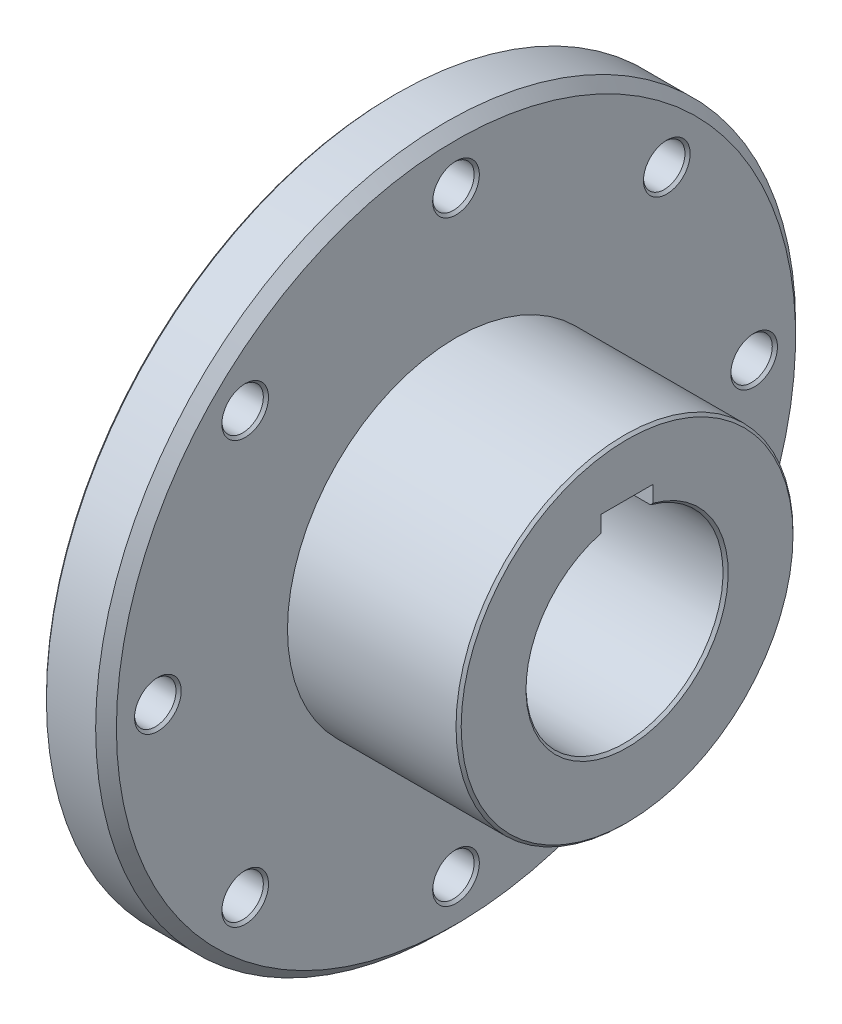
ISO-10303-21;
HEADER;
FILE_DESCRIPTION(('STEP AP214'),'2;1');
FILE_NAME('part.step','',(''),(''),'','','');
FILE_SCHEMA(('AUTOMOTIVE_DESIGN { 1 0 10303 214 1 1 1 1 }'));
ENDSEC;
DATA;
#1=APPLICATION_CONTEXT('core data for automotive mechanical design processes');
#2=APPLICATION_PROTOCOL_DEFINITION('international standard','automotive_design',2000,#1);
#3=PRODUCT_CONTEXT('',#1,'mechanical');
#4=PRODUCT('Part','Part','',(#3));
#5=PRODUCT_RELATED_PRODUCT_CATEGORY('part','',(#4));
#6=PRODUCT_DEFINITION_FORMATION('','',#4);
#7=PRODUCT_DEFINITION_CONTEXT('part definition',#1,'design');
#8=PRODUCT_DEFINITION('design','',#6,#7);
#9=PRODUCT_DEFINITION_SHAPE('','',#8);
#10=(LENGTH_UNIT() NAMED_UNIT(*) SI_UNIT(.MILLI.,.METRE.));
#11=(NAMED_UNIT(*) PLANE_ANGLE_UNIT() SI_UNIT($,.RADIAN.));
#12=(NAMED_UNIT(*) SI_UNIT($,.STERADIAN.) SOLID_ANGLE_UNIT());
#13=UNCERTAINTY_MEASURE_WITH_UNIT(LENGTH_MEASURE(1.E-05),#10,'distance_accuracy_value','');
#14=(GEOMETRIC_REPRESENTATION_CONTEXT(3) GLOBAL_UNCERTAINTY_ASSIGNED_CONTEXT((#13)) GLOBAL_UNIT_ASSIGNED_CONTEXT((#10,
#11,#12)) REPRESENTATION_CONTEXT('',''));
#15=CARTESIAN_POINT('',(0.,0.,0.));
#16=DIRECTION('',(0.,0.,1.));
#17=DIRECTION('',(1.,0.,0.));
#18=AXIS2_PLACEMENT_3D('',#15,#16,#17);
#19=CARTESIAN_POINT('',(0.,0.,0.));
#20=DIRECTION('',(-1.,0.,0.));
#21=DIRECTION('',(0.,0.,1.));
#22=AXIS2_PLACEMENT_3D('',#19,#20,#21);
#23=CYLINDRICAL_SURFACE('',#22,19.);
#24=DIRECTION('',(-1.,0.,0.));
#25=VECTOR('',#24,1.);
#26=CARTESIAN_POINT('',(0.,18.3303027798234,5.));
#27=LINE('',#26,#25);
#28=CARTESIAN_POINT('',(0.999999999999977,18.3303027798234,5.));
#29=VERTEX_POINT('',#28);
#30=CARTESIAN_POINT('',(54.5,18.3303027798234,5.));
#31=VERTEX_POINT('',#30);
#32=EDGE_CURVE('E125',#29,#31,#27,.F.);
#33=ORIENTED_EDGE('',*,*,#32,.T.);
#34=CARTESIAN_POINT('',(54.5,0.,0.));
#35=DIRECTION('',(-1.,0.,0.));
#36=DIRECTION('',(0.,0.,1.));
#37=AXIS2_PLACEMENT_3D('',#34,#35,#36);
#38=CIRCLE('',#37,19.);
#39=CARTESIAN_POINT('',(54.5,18.3303027798234,-5.));
#40=VERTEX_POINT('',#39);
#41=EDGE_CURVE('E53',#31,#40,#38,.F.);
#42=ORIENTED_EDGE('',*,*,#41,.T.);
#43=DIRECTION('',(-1.,0.,0.));
#44=VECTOR('',#43,1.);
#45=CARTESIAN_POINT('',(0.,18.3303027798234,-5.));
#46=LINE('',#45,#44);
#47=CARTESIAN_POINT('',(0.999999999999977,18.3303027798234,-5.));
#48=VERTEX_POINT('',#47);
#49=EDGE_CURVE('E128',#40,#48,#46,.T.);
#50=ORIENTED_EDGE('',*,*,#49,.T.);
#51=CARTESIAN_POINT('',(0.999999999999977,0.,0.));
#52=DIRECTION('',(1.,0.,0.));
#53=DIRECTION('',(0.,0.,-1.));
#54=AXIS2_PLACEMENT_3D('',#51,#52,#53);
#55=CIRCLE('',#54,19.);
#56=EDGE_CURVE('E146',#48,#29,#55,.F.);
#57=ORIENTED_EDGE('',*,*,#56,.T.);
#58=EDGE_LOOP('',(#33,#42,#50,#57));
#59=FACE_BOUND('',#58,.T.);
#60=ADVANCED_FACE('F37',(#59),#23,.F.);
#61=CARTESIAN_POINT('',(0.,19.,0.));
#62=DIRECTION('',(1.,0.,0.));
#63=DIRECTION('',(0.,0.,-1.));
#64=AXIS2_PLACEMENT_3D('',#61,#62,#63);
#65=PLANE('',#64);
#66=DIRECTION('',(0.,-1.,0.));
#67=VECTOR('',#66,1.);
#68=CARTESIAN_POINT('',(0.,22.,5.));
#69=LINE('',#68,#67);
#70=CARTESIAN_POINT('',(0.,22.,5.));
#71=VERTEX_POINT('',#70);
#72=CARTESIAN_POINT('',(0.,19.3649167310371,5.));
#73=VERTEX_POINT('',#72);
#74=EDGE_CURVE('E115',#71,#73,#69,.T.);
#75=ORIENTED_EDGE('',*,*,#74,.T.);
#76=CARTESIAN_POINT('',(0.,0.,0.));
#77=DIRECTION('',(1.,0.,0.));
#78=DIRECTION('',(0.,0.,-1.));
#79=AXIS2_PLACEMENT_3D('',#76,#77,#78);
#80=CIRCLE('',#79,20.);
#81=CARTESIAN_POINT('',(0.,19.3649167310371,-5.));
#82=VERTEX_POINT('',#81);
#83=EDGE_CURVE('E100',#73,#82,#80,.T.);
#84=ORIENTED_EDGE('',*,*,#83,.T.);
#85=DIRECTION('',(0.,1.,0.));
#86=VECTOR('',#85,1.);
#87=CARTESIAN_POINT('',(0.,22.,-5.));
#88=LINE('',#87,#86);
#89=CARTESIAN_POINT('',(0.,22.,-5.));
#90=VERTEX_POINT('',#89);
#91=EDGE_CURVE('E92',#82,#90,#88,.T.);
#92=ORIENTED_EDGE('',*,*,#91,.T.);
#93=DIRECTION('',(0.,0.,1.));
#94=VECTOR('',#93,1.);
#95=CARTESIAN_POINT('',(0.,22.,5.));
#96=LINE('',#95,#94);
#97=EDGE_CURVE('E98',#90,#71,#96,.T.);
#98=ORIENTED_EDGE('',*,*,#97,.T.);
#99=EDGE_LOOP('',(#75,#84,#92,#98));
#100=FACE_BOUND('',#99,.T.);
#101=CARTESIAN_POINT('',(0.,0.,0.));
#102=DIRECTION('',(-1.,0.,0.));
#103=DIRECTION('',(0.,0.,1.));
#104=AXIS2_PLACEMENT_3D('',#101,#102,#103);
#105=CIRCLE('',#104,32.5);
#106=CARTESIAN_POINT('',(0.,0.,32.5));
#107=VERTEX_POINT('',#106);
#108=EDGE_CURVE('E136',#107,#107,#105,.T.);
#109=ORIENTED_EDGE('',*,*,#108,.T.);
#110=EDGE_LOOP('',(#109));
#111=FACE_BOUND('',#110,.T.);
#112=ADVANCED_FACE('F95',(#100,#111),#65,.F.);
#113=CARTESIAN_POINT('',(0.,0.,0.));
#114=DIRECTION('',(-1.,0.,0.));
#115=DIRECTION('',(0.,0.,1.));
#116=AXIS2_PLACEMENT_3D('',#113,#114,#115);
#117=CYLINDRICAL_SURFACE('',#116,32.5);
#118=ORIENTED_EDGE('',*,*,#108,.F.);
#119=EDGE_LOOP('',(#118));
#120=FACE_BOUND('',#119,.T.);
#121=CARTESIAN_POINT('',(10.,0.,0.));
#122=DIRECTION('',(-1.,0.,0.));
#123=DIRECTION('',(0.,0.,1.));
#124=AXIS2_PLACEMENT_3D('',#121,#122,#123);
#125=CIRCLE('',#124,32.5);
#126=CARTESIAN_POINT('',(10.,0.,32.5));
#127=VERTEX_POINT('',#126);
#128=EDGE_CURVE('E133',#127,#127,#125,.T.);
#129=ORIENTED_EDGE('',*,*,#128,.T.);
#130=EDGE_LOOP('',(#129));
#131=FACE_BOUND('',#130,.T.);
#132=ADVANCED_FACE('F328',(#120,#131),#117,.T.);
#133=CARTESIAN_POINT('',(10.,32.5,0.));
#134=DIRECTION('',(1.,0.,0.));
#135=DIRECTION('',(0.,0.,-1.));
#136=AXIS2_PLACEMENT_3D('',#133,#134,#135);
#137=PLANE('',#136);
#138=CARTESIAN_POINT('',(10.,40.6586399182265,40.6586399182265));
#139=DIRECTION('',(1.,0.,0.));
#140=DIRECTION('',(0.,0.,-1.));
#141=AXIS2_PLACEMENT_3D('',#138,#139,#140);
#142=CIRCLE('',#141,4.49999999999998);
#143=CARTESIAN_POINT('',(10.,40.6586399182265,36.1586399182265));
#144=VERTEX_POINT('',#143);
#145=EDGE_CURVE('E238',#144,#144,#142,.T.);
#146=ORIENTED_EDGE('',*,*,#145,.T.);
#147=EDGE_LOOP('',(#146));
#148=FACE_BOUND('',#147,.T.);
#149=CARTESIAN_POINT('',(10.,0.,57.5));
#150=DIRECTION('',(1.,0.,0.));
#151=DIRECTION('',(0.,0.,-1.));
#152=AXIS2_PLACEMENT_3D('',#149,#150,#151);
#153=CIRCLE('',#152,4.49999999999998);
#154=CARTESIAN_POINT('',(10.,0.,53.));
#155=VERTEX_POINT('',#154);
#156=EDGE_CURVE('E235',#155,#155,#153,.T.);
#157=ORIENTED_EDGE('',*,*,#156,.T.);
#158=EDGE_LOOP('',(#157));
#159=FACE_BOUND('',#158,.T.);
#160=CARTESIAN_POINT('',(10.,-40.6586399182265,40.6586399182265));
#161=DIRECTION('',(1.,0.,0.));
#162=DIRECTION('',(0.,0.,-1.));
#163=AXIS2_PLACEMENT_3D('',#160,#161,#162);
#164=CIRCLE('',#163,4.49999999999998);
#165=CARTESIAN_POINT('',(10.,-40.6586399182265,36.1586399182265));
#166=VERTEX_POINT('',#165);
#167=EDGE_CURVE('E232',#166,#166,#164,.T.);
#168=ORIENTED_EDGE('',*,*,#167,.T.);
#169=EDGE_LOOP('',(#168));
#170=FACE_BOUND('',#169,.T.);
#171=CARTESIAN_POINT('',(10.,-57.5,0.));
#172=DIRECTION('',(1.,0.,0.));
#173=DIRECTION('',(0.,0.,-1.));
#174=AXIS2_PLACEMENT_3D('',#171,#172,#173);
#175=CIRCLE('',#174,4.5);
#176=CARTESIAN_POINT('',(10.,-57.5,-4.50000000000001));
#177=VERTEX_POINT('',#176);
#178=EDGE_CURVE('E229',#177,#177,#175,.T.);
#179=ORIENTED_EDGE('',*,*,#178,.T.);
#180=EDGE_LOOP('',(#179));
#181=FACE_BOUND('',#180,.T.);
#182=CARTESIAN_POINT('',(10.,-40.6586399182265,-40.6586399182265));
#183=DIRECTION('',(1.,0.,0.));
#184=DIRECTION('',(0.,0.,-1.));
#185=AXIS2_PLACEMENT_3D('',#182,#183,#184);
#186=CIRCLE('',#185,4.49999999999998);
#187=CARTESIAN_POINT('',(10.,-40.6586399182265,-45.1586399182265));
#188=VERTEX_POINT('',#187);
#189=EDGE_CURVE('E226',#188,#188,#186,.T.);
#190=ORIENTED_EDGE('',*,*,#189,.T.);
#191=EDGE_LOOP('',(#190));
#192=FACE_BOUND('',#191,.T.);
#193=CARTESIAN_POINT('',(10.,0.,-57.5));
#194=DIRECTION('',(1.,0.,0.));
#195=DIRECTION('',(0.,0.,-1.));
#196=AXIS2_PLACEMENT_3D('',#193,#194,#195);
#197=CIRCLE('',#196,4.49999999999998);
#198=CARTESIAN_POINT('',(10.,0.,-62.));
#199=VERTEX_POINT('',#198);
#200=EDGE_CURVE('E223',#199,#199,#197,.T.);
#201=ORIENTED_EDGE('',*,*,#200,.T.);
#202=EDGE_LOOP('',(#201));
#203=FACE_BOUND('',#202,.T.);
#204=CARTESIAN_POINT('',(10.,40.6586399182265,-40.6586399182265));
#205=DIRECTION('',(1.,0.,0.));
#206=DIRECTION('',(0.,0.,-1.));
#207=AXIS2_PLACEMENT_3D('',#204,#205,#206);
#208=CIRCLE('',#207,4.50000000000006);
#209=CARTESIAN_POINT('',(10.,40.6586399182265,-45.1586399182265));
#210=VERTEX_POINT('',#209);
#211=EDGE_CURVE('E220',#210,#210,#208,.T.);
#212=ORIENTED_EDGE('',*,*,#211,.T.);
#213=EDGE_LOOP('',(#212));
#214=FACE_BOUND('',#213,.T.);
#215=CARTESIAN_POINT('',(10.,57.5,0.));
#216=DIRECTION('',(1.,0.,0.));
#217=DIRECTION('',(0.,0.,-1.));
#218=AXIS2_PLACEMENT_3D('',#215,#216,#217);
#219=CIRCLE('',#218,4.5);
#220=CARTESIAN_POINT('',(10.,57.5,-4.5));
#221=VERTEX_POINT('',#220);
#222=EDGE_CURVE('E217',#221,#221,#219,.T.);
#223=ORIENTED_EDGE('',*,*,#222,.T.);
#224=EDGE_LOOP('',(#223));
#225=FACE_BOUND('',#224,.T.);
#226=CARTESIAN_POINT('',(10.,0.,0.));
#227=DIRECTION('',(1.,0.,0.));
#228=DIRECTION('',(0.,0.,-1.));
#229=AXIS2_PLACEMENT_3D('',#226,#227,#228);
#230=CIRCLE('',#229,67.);
#231=CARTESIAN_POINT('',(10.,0.,-67.));
#232=VERTEX_POINT('',#231);
#233=EDGE_CURVE('E214',#232,#232,#230,.F.);
#234=ORIENTED_EDGE('',*,*,#233,.T.);
#235=EDGE_LOOP('',(#234));
#236=FACE_BOUND('',#235,.T.);
#237=ORIENTED_EDGE('',*,*,#128,.F.);
#238=EDGE_LOOP('',(#237));
#239=FACE_BOUND('',#238,.T.);
#240=ADVANCED_FACE('F353',(#148,#159,#170,#181,#192,#203,#214,#225,#236,#239),#137,.F.);
#241=CARTESIAN_POINT('',(0.,0.,0.));
#242=DIRECTION('',(-1.,0.,0.));
#243=DIRECTION('',(0.,0.,1.));
#244=AXIS2_PLACEMENT_3D('',#241,#242,#243);
#245=CYLINDRICAL_SURFACE('',#244,67.5);
#246=CARTESIAN_POINT('',(10.5,0.,0.));
#247=DIRECTION('',(1.,0.,0.));
#248=DIRECTION('',(0.,0.,-1.));
#249=AXIS2_PLACEMENT_3D('',#246,#247,#248);
#250=CIRCLE('',#249,67.5);
#251=CARTESIAN_POINT('',(10.5,0.,-67.5));
#252=VERTEX_POINT('',#251);
#253=EDGE_CURVE('E11',#252,#252,#250,.T.);
#254=ORIENTED_EDGE('',*,*,#253,.T.);
#255=EDGE_LOOP('',(#254));
#256=FACE_BOUND('',#255,.T.);
#257=CARTESIAN_POINT('',(20.,0.,0.));
#258=DIRECTION('',(-1.,0.,0.));
#259=DIRECTION('',(0.,0.,1.));
#260=AXIS2_PLACEMENT_3D('',#257,#258,#259);
#261=CIRCLE('',#260,67.5);
#262=CARTESIAN_POINT('',(20.,0.,67.5));
#263=VERTEX_POINT('',#262);
#264=EDGE_CURVE('E140',#263,#263,#261,.T.);
#265=ORIENTED_EDGE('',*,*,#264,.T.);
#266=EDGE_LOOP('',(#265));
#267=FACE_BOUND('',#266,.T.);
#268=ADVANCED_FACE('F350',(#256,#267),#245,.T.);
#269=CARTESIAN_POINT('',(22.,67.5,0.));
#270=DIRECTION('',(-1.,0.,0.));
#271=DIRECTION('',(0.,0.,1.));
#272=AXIS2_PLACEMENT_3D('',#269,#270,#271);
#273=PLANE('',#272);
#274=CARTESIAN_POINT('',(22.,40.6586399182265,40.6586399182265));
#275=DIRECTION('',(-1.,0.,0.));
#276=DIRECTION('',(0.,0.,1.));
#277=AXIS2_PLACEMENT_3D('',#274,#275,#276);
#278=CIRCLE('',#277,4.5);
#279=CARTESIAN_POINT('',(22.,40.6586399182265,45.1586399182265));
#280=VERTEX_POINT('',#279);
#281=EDGE_CURVE('E310',#280,#280,#278,.T.);
#282=ORIENTED_EDGE('',*,*,#281,.T.);
#283=EDGE_LOOP('',(#282));
#284=FACE_BOUND('',#283,.T.);
#285=CARTESIAN_POINT('',(22.,57.5,0.));
#286=DIRECTION('',(-1.,0.,0.));
#287=DIRECTION('',(0.,0.,1.));
#288=AXIS2_PLACEMENT_3D('',#285,#286,#287);
#289=CIRCLE('',#288,4.5);
#290=CARTESIAN_POINT('',(22.,57.5,4.5));
#291=VERTEX_POINT('',#290);
#292=EDGE_CURVE('E307',#291,#291,#289,.T.);
#293=ORIENTED_EDGE('',*,*,#292,.T.);
#294=EDGE_LOOP('',(#293));
#295=FACE_BOUND('',#294,.T.);
#296=CARTESIAN_POINT('',(22.,0.,-57.5));
#297=DIRECTION('',(-1.,0.,0.));
#298=DIRECTION('',(0.,0.,1.));
#299=AXIS2_PLACEMENT_3D('',#296,#297,#298);
#300=CIRCLE('',#299,4.5);
#301=CARTESIAN_POINT('',(22.,0.,-53.));
#302=VERTEX_POINT('',#301);
#303=EDGE_CURVE('E304',#302,#302,#300,.T.);
#304=ORIENTED_EDGE('',*,*,#303,.T.);
#305=EDGE_LOOP('',(#304));
#306=FACE_BOUND('',#305,.T.);
#307=CARTESIAN_POINT('',(22.,40.6586399182265,-40.6586399182265));
#308=DIRECTION('',(-1.,0.,0.));
#309=DIRECTION('',(0.,0.,1.));
#310=AXIS2_PLACEMENT_3D('',#307,#308,#309);
#311=CIRCLE('',#310,4.5);
#312=CARTESIAN_POINT('',(22.,40.6586399182265,-36.1586399182265));
#313=VERTEX_POINT('',#312);
#314=EDGE_CURVE('E301',#313,#313,#311,.T.);
#315=ORIENTED_EDGE('',*,*,#314,.T.);
#316=EDGE_LOOP('',(#315));
#317=FACE_BOUND('',#316,.T.);
#318=CARTESIAN_POINT('',(22.,-40.6586399182265,-40.6586399182265));
#319=DIRECTION('',(-1.,0.,0.));
#320=DIRECTION('',(0.,0.,1.));
#321=AXIS2_PLACEMENT_3D('',#318,#319,#320);
#322=CIRCLE('',#321,4.5);
#323=CARTESIAN_POINT('',(22.,-40.6586399182265,-36.1586399182265));
#324=VERTEX_POINT('',#323);
#325=EDGE_CURVE('E298',#324,#324,#322,.T.);
#326=ORIENTED_EDGE('',*,*,#325,.T.);
#327=EDGE_LOOP('',(#326));
#328=FACE_BOUND('',#327,.T.);
#329=CARTESIAN_POINT('',(22.,-57.5,0.));
#330=DIRECTION('',(-1.,0.,0.));
#331=DIRECTION('',(0.,0.,1.));
#332=AXIS2_PLACEMENT_3D('',#329,#330,#331);
#333=CIRCLE('',#332,4.5);
#334=CARTESIAN_POINT('',(22.,-57.5,4.5));
#335=VERTEX_POINT('',#334);
#336=EDGE_CURVE('E295',#335,#335,#333,.T.);
#337=ORIENTED_EDGE('',*,*,#336,.T.);
#338=EDGE_LOOP('',(#337));
#339=FACE_BOUND('',#338,.T.);
#340=CARTESIAN_POINT('',(22.,-40.6586399182265,40.6586399182265));
#341=DIRECTION('',(-1.,0.,0.));
#342=DIRECTION('',(0.,0.,1.));
#343=AXIS2_PLACEMENT_3D('',#340,#341,#342);
#344=CIRCLE('',#343,4.49999999999995);
#345=CARTESIAN_POINT('',(22.,-40.6586399182265,45.1586399182264));
#346=VERTEX_POINT('',#345);
#347=EDGE_CURVE('E292',#346,#346,#344,.T.);
#348=ORIENTED_EDGE('',*,*,#347,.T.);
#349=EDGE_LOOP('',(#348));
#350=FACE_BOUND('',#349,.T.);
#351=CARTESIAN_POINT('',(22.,0.,57.5));
#352=DIRECTION('',(-1.,0.,0.));
#353=DIRECTION('',(0.,0.,1.));
#354=AXIS2_PLACEMENT_3D('',#351,#352,#353);
#355=CIRCLE('',#354,4.5);
#356=CARTESIAN_POINT('',(22.,0.,62.));
#357=VERTEX_POINT('',#356);
#358=EDGE_CURVE('E289',#357,#357,#355,.T.);
#359=ORIENTED_EDGE('',*,*,#358,.T.);
#360=EDGE_LOOP('',(#359));
#361=FACE_BOUND('',#360,.T.);
#362=CARTESIAN_POINT('',(22.,0.,0.));
#363=DIRECTION('',(-1.,0.,0.));
#364=DIRECTION('',(0.,0.,1.));
#365=AXIS2_PLACEMENT_3D('',#362,#363,#364);
#366=CIRCLE('',#365,65.5);
#367=CARTESIAN_POINT('',(22.,0.,65.5));
#368=VERTEX_POINT('',#367);
#369=EDGE_CURVE('E143',#368,#368,#366,.F.);
#370=ORIENTED_EDGE('',*,*,#369,.T.);
#371=EDGE_LOOP('',(#370));
#372=FACE_BOUND('',#371,.T.);
#373=CARTESIAN_POINT('',(22.,0.,0.));
#374=DIRECTION('',(-1.,0.,0.));
#375=DIRECTION('',(0.,0.,1.));
#376=AXIS2_PLACEMENT_3D('',#373,#374,#375);
#377=CIRCLE('',#376,32.5);
#378=CARTESIAN_POINT('',(22.,0.,32.5));
#379=VERTEX_POINT('',#378);
#380=EDGE_CURVE('E130',#379,#379,#377,.T.);
#381=ORIENTED_EDGE('',*,*,#380,.T.);
#382=EDGE_LOOP('',(#381));
#383=FACE_BOUND('',#382,.T.);
#384=ADVANCED_FACE('F352',(#284,#295,#306,#317,#328,#339,#350,#361,#372,#383),#273,.F.);
#385=CARTESIAN_POINT('',(0.,0.,0.));
#386=DIRECTION('',(-1.,0.,0.));
#387=DIRECTION('',(0.,0.,1.));
#388=AXIS2_PLACEMENT_3D('',#385,#386,#387);
#389=CYLINDRICAL_SURFACE('',#388,32.5);
#390=CARTESIAN_POINT('',(54.5,0.,0.));
#391=DIRECTION('',(-1.,0.,0.));
#392=DIRECTION('',(0.,0.,1.));
#393=AXIS2_PLACEMENT_3D('',#390,#391,#392);
#394=CIRCLE('',#393,32.5);
#395=CARTESIAN_POINT('',(54.5,0.,32.5));
#396=VERTEX_POINT('',#395);
#397=EDGE_CURVE('E46',#396,#396,#394,.T.);
#398=ORIENTED_EDGE('',*,*,#397,.T.);
#399=EDGE_LOOP('',(#398));
#400=FACE_BOUND('',#399,.T.);
#401=ORIENTED_EDGE('',*,*,#380,.F.);
#402=EDGE_LOOP('',(#401));
#403=FACE_BOUND('',#402,.T.);
#404=ADVANCED_FACE('F360',(#400,#403),#389,.T.);
#405=CARTESIAN_POINT('',(55.,32.5,0.));
#406=DIRECTION('',(-1.,0.,0.));
#407=DIRECTION('',(0.,0.,1.));
#408=AXIS2_PLACEMENT_3D('',#405,#406,#407);
#409=PLANE('',#408);
#410=CARTESIAN_POINT('',(55.,0.,0.));
#411=DIRECTION('',(-1.,0.,0.));
#412=DIRECTION('',(0.,0.,1.));
#413=AXIS2_PLACEMENT_3D('',#410,#411,#412);
#414=CIRCLE('',#413,32.);
#415=CARTESIAN_POINT('',(55.,0.,32.));
#416=VERTEX_POINT('',#415);
#417=EDGE_CURVE('E312',#416,#416,#414,.F.);
#418=ORIENTED_EDGE('',*,*,#417,.T.);
#419=EDGE_LOOP('',(#418));
#420=FACE_BOUND('',#419,.T.);
#421=DIRECTION('',(0.,-1.,0.));
#422=VECTOR('',#421,1.);
#423=CARTESIAN_POINT('',(55.,32.5,-5.));
#424=LINE('',#423,#422);
#425=CARTESIAN_POINT('',(55.,22.,-5.));
#426=VERTEX_POINT('',#425);
#427=CARTESIAN_POINT('',(55.,18.8480768249708,-5.));
#428=VERTEX_POINT('',#427);
#429=EDGE_CURVE('E110',#426,#428,#424,.T.);
#430=ORIENTED_EDGE('',*,*,#429,.T.);
#431=CARTESIAN_POINT('',(55.,0.,0.));
#432=DIRECTION('',(-1.,0.,0.));
#433=DIRECTION('',(0.,0.,1.));
#434=AXIS2_PLACEMENT_3D('',#431,#432,#433);
#435=CIRCLE('',#434,19.5);
#436=CARTESIAN_POINT('',(55.,18.8480768249708,5.));
#437=VERTEX_POINT('',#436);
#438=EDGE_CURVE('E180',#428,#437,#435,.T.);
#439=ORIENTED_EDGE('',*,*,#438,.T.);
#440=DIRECTION('',(0.,-1.,0.));
#441=VECTOR('',#440,1.);
#442=CARTESIAN_POINT('',(55.,22.,5.));
#443=LINE('',#442,#441);
#444=CARTESIAN_POINT('',(55.,22.,5.));
#445=VERTEX_POINT('',#444);
#446=EDGE_CURVE('E104',#445,#437,#443,.T.);
#447=ORIENTED_EDGE('',*,*,#446,.F.);
#448=DIRECTION('',(0.,0.,1.));
#449=VECTOR('',#448,1.);
#450=CARTESIAN_POINT('',(55.,22.,5.));
#451=LINE('',#450,#449);
#452=EDGE_CURVE('E122',#426,#445,#451,.T.);
#453=ORIENTED_EDGE('',*,*,#452,.F.);
#454=EDGE_LOOP('',(#430,#439,#447,#453));
#455=FACE_BOUND('',#454,.T.);
#456=ADVANCED_FACE('F205',(#420,#455),#409,.F.);
#457=CARTESIAN_POINT('',(0.,22.,-5.));
#458=DIRECTION('',(0.,0.,-1.));
#459=DIRECTION('',(0.,1.,0.));
#460=AXIS2_PLACEMENT_3D('',#457,#458,#459);
#461=PLANE('',#460);
#462=ORIENTED_EDGE('',*,*,#49,.F.);
#463=CARTESIAN_POINT('',(54.5,18.3303027798234,-5.));
#464=CARTESIAN_POINT('',(54.5832928104394,18.416637585966,-5.));
#465=CARTESIAN_POINT('',(54.6666058823556,18.5029528261639,-5.));
#466=CARTESIAN_POINT('',(54.8332725490223,18.6755441745463,-5.));
#467=CARTESIAN_POINT('',(54.9166261437728,18.7618202827309,-5.));
#468=CARTESIAN_POINT('',(55.,18.8480768249708,-5.));
#469=B_SPLINE_CURVE_WITH_KNOTS('',3,(#463,#464,#465,#466,#467,#468),.UNSPECIFIED.,.F.,.F.,(4,2,
4),(0.,0.359892341934003,0.719784683352684),.UNSPECIFIED.);
#470=EDGE_CURVE('E197',#40,#428,#469,.T.);
#471=ORIENTED_EDGE('',*,*,#470,.T.);
#472=ORIENTED_EDGE('',*,*,#429,.F.);
#473=DIRECTION('',(1.,0.,0.));
#474=VECTOR('',#473,1.);
#475=CARTESIAN_POINT('',(0.,22.,-5.));
#476=LINE('',#475,#474);
#477=EDGE_CURVE('E107',#90,#426,#476,.T.);
#478=ORIENTED_EDGE('',*,*,#477,.F.);
#479=ORIENTED_EDGE('',*,*,#91,.F.);
#480=CARTESIAN_POINT('',(0.,19.3649167310371,-5.));
#481=CARTESIAN_POINT('',(0.166822267536469,19.1926314693435,-5.));
#482=CARTESIAN_POINT('',(0.333566734203452,19.0202710096794,-5.));
#483=CARTESIAN_POINT('',(0.666900067538402,18.6753996926097,-5.));
#484=CARTESIAN_POINT('',(0.833488934204745,18.5028888352026,-5.));
#485=CARTESIAN_POINT('',(0.999999999999977,18.3303027798234,-5.));
#486=B_SPLINE_CURVE_WITH_KNOTS('',3,(#480,#481,#482,#483,#484,#485),.UNSPECIFIED.,.F.,.F.,(4,2,
4),(0.,0.71944882165253,1.43889765081593),.UNSPECIFIED.);
#487=EDGE_CURVE('E208',#82,#48,#486,.T.);
#488=ORIENTED_EDGE('',*,*,#487,.T.);
#489=EDGE_LOOP('',(#462,#471,#472,#478,#479,#488));
#490=FACE_BOUND('',#489,.T.);
#491=ADVANCED_FACE('F108',(#490),#461,.F.);
#492=CARTESIAN_POINT('',(0.,22.,5.));
#493=DIRECTION('',(0.,0.,1.));
#494=DIRECTION('',(0.,-1.,0.));
#495=AXIS2_PLACEMENT_3D('',#492,#493,#494);
#496=PLANE('',#495);
#497=ORIENTED_EDGE('',*,*,#446,.T.);
#498=CARTESIAN_POINT('',(55.,18.8480768249708,5.));
#499=CARTESIAN_POINT('',(54.9166261437728,18.7618202827309,5.));
#500=CARTESIAN_POINT('',(54.8332725490223,18.6755441745463,5.));
#501=CARTESIAN_POINT('',(54.6666058823556,18.5029528261639,5.));
#502=CARTESIAN_POINT('',(54.5832928104394,18.416637585966,5.));
#503=CARTESIAN_POINT('',(54.5,18.3303027798234,5.));
#504=B_SPLINE_CURVE_WITH_KNOTS('',3,(#498,#499,#500,#501,#502,#503),.UNSPECIFIED.,.F.,.F.,(4,2,
4),(0.,0.359892341418681,0.719784683352681),.UNSPECIFIED.);
#505=EDGE_CURVE('E61',#437,#31,#504,.T.);
#506=ORIENTED_EDGE('',*,*,#505,.T.);
#507=ORIENTED_EDGE('',*,*,#32,.F.);
#508=CARTESIAN_POINT('',(0.999999999999977,18.3303027798234,5.));
#509=CARTESIAN_POINT('',(0.833488934204745,18.5028888352026,5.));
#510=CARTESIAN_POINT('',(0.666900067538401,18.6753996926097,5.));
#511=CARTESIAN_POINT('',(0.333566734203452,19.0202710096794,5.));
#512=CARTESIAN_POINT('',(0.166822267536469,19.1926314693435,5.));
#513=CARTESIAN_POINT('',(0.,19.3649167310371,5.));
#514=B_SPLINE_CURVE_WITH_KNOTS('',3,(#508,#509,#510,#511,#512,#513),.UNSPECIFIED.,.F.,.F.,(4,2,
4),(0.,0.719448829163395,1.43889765081593),.UNSPECIFIED.);
#515=EDGE_CURVE('E149',#29,#73,#514,.T.);
#516=ORIENTED_EDGE('',*,*,#515,.T.);
#517=ORIENTED_EDGE('',*,*,#74,.F.);
#518=DIRECTION('',(1.,0.,0.));
#519=VECTOR('',#518,1.);
#520=CARTESIAN_POINT('',(0.,22.,5.));
#521=LINE('',#520,#519);
#522=EDGE_CURVE('E114',#71,#445,#521,.T.);
#523=ORIENTED_EDGE('',*,*,#522,.T.);
#524=EDGE_LOOP('',(#497,#506,#507,#516,#517,#523));
#525=FACE_BOUND('',#524,.T.);
#526=ADVANCED_FACE('F163',(#525),#496,.F.);
#527=CARTESIAN_POINT('',(0.,22.,5.));
#528=DIRECTION('',(0.,1.,0.));
#529=DIRECTION('',(0.,0.,1.));
#530=AXIS2_PLACEMENT_3D('',#527,#528,#529);
#531=PLANE('',#530);
#532=ORIENTED_EDGE('',*,*,#452,.T.);
#533=ORIENTED_EDGE('',*,*,#522,.F.);
#534=ORIENTED_EDGE('',*,*,#97,.F.);
#535=ORIENTED_EDGE('',*,*,#477,.T.);
#536=EDGE_LOOP('',(#532,#533,#534,#535));
#537=FACE_BOUND('',#536,.T.);
#538=ADVANCED_FACE('F117',(#537),#531,.F.);
#539=CARTESIAN_POINT('',(0.,40.6586399182265,40.6586399182265));
#540=DIRECTION('',(1.,0.,0.));
#541=DIRECTION('',(0.,0.,-1.));
#542=AXIS2_PLACEMENT_3D('',#539,#540,#541);
#543=CYLINDRICAL_SURFACE('',#542,4.00000000000001);
#544=CARTESIAN_POINT('',(10.5,40.6586399182265,40.6586399182265));
#545=DIRECTION('',(1.,0.,0.));
#546=DIRECTION('',(0.,0.,-1.));
#547=AXIS2_PLACEMENT_3D('',#544,#545,#546);
#548=CIRCLE('',#547,4.00000000000001);
#549=CARTESIAN_POINT('',(10.5,40.6586399182265,36.6586399182265));
#550=VERTEX_POINT('',#549);
#551=EDGE_CURVE('E244',#550,#550,#548,.F.);
#552=ORIENTED_EDGE('',*,*,#551,.T.);
#553=EDGE_LOOP('',(#552));
#554=FACE_BOUND('',#553,.T.);
#555=CARTESIAN_POINT('',(21.5,40.6586399182265,40.6586399182265));
#556=DIRECTION('',(-1.,0.,0.));
#557=DIRECTION('',(0.,0.,1.));
#558=AXIS2_PLACEMENT_3D('',#555,#556,#557);
#559=CIRCLE('',#558,4.00000000000001);
#560=CARTESIAN_POINT('',(21.5,40.6586399182265,44.6586399182265));
#561=VERTEX_POINT('',#560);
#562=EDGE_CURVE('E241',#561,#561,#559,.F.);
#563=ORIENTED_EDGE('',*,*,#562,.T.);
#564=EDGE_LOOP('',(#563));
#565=FACE_BOUND('',#564,.T.);
#566=ADVANCED_FACE('F168',(#554,#565),#543,.F.);
#567=CARTESIAN_POINT('',(0.,0.,57.5));
#568=DIRECTION('',(1.,0.,0.));
#569=DIRECTION('',(0.,0.,-1.));
#570=AXIS2_PLACEMENT_3D('',#567,#568,#569);
#571=CYLINDRICAL_SURFACE('',#570,4.00000000000001);
#572=CARTESIAN_POINT('',(10.5,0.,57.5));
#573=DIRECTION('',(1.,0.,0.));
#574=DIRECTION('',(0.,0.,-1.));
#575=AXIS2_PLACEMENT_3D('',#572,#573,#574);
#576=CIRCLE('',#575,4.00000000000001);
#577=CARTESIAN_POINT('',(10.5,0.,53.5));
#578=VERTEX_POINT('',#577);
#579=EDGE_CURVE('E250',#578,#578,#576,.F.);
#580=ORIENTED_EDGE('',*,*,#579,.T.);
#581=EDGE_LOOP('',(#580));
#582=FACE_BOUND('',#581,.T.);
#583=CARTESIAN_POINT('',(21.5,0.,57.5));
#584=DIRECTION('',(-1.,0.,0.));
#585=DIRECTION('',(0.,0.,1.));
#586=AXIS2_PLACEMENT_3D('',#583,#584,#585);
#587=CIRCLE('',#586,4.00000000000001);
#588=CARTESIAN_POINT('',(21.5,0.,61.5));
#589=VERTEX_POINT('',#588);
#590=EDGE_CURVE('E247',#589,#589,#587,.F.);
#591=ORIENTED_EDGE('',*,*,#590,.T.);
#592=EDGE_LOOP('',(#591));
#593=FACE_BOUND('',#592,.T.);
#594=ADVANCED_FACE('F431',(#582,#593),#571,.F.);
#595=CARTESIAN_POINT('',(0.,-40.6586399182265,40.6586399182265));
#596=DIRECTION('',(1.,0.,0.));
#597=DIRECTION('',(0.,0.,-1.));
#598=AXIS2_PLACEMENT_3D('',#595,#596,#597);
#599=CYLINDRICAL_SURFACE('',#598,4.00000000000001);
#600=CARTESIAN_POINT('',(10.5,-40.6586399182265,40.6586399182265));
#601=DIRECTION('',(1.,0.,0.));
#602=DIRECTION('',(0.,0.,-1.));
#603=AXIS2_PLACEMENT_3D('',#600,#601,#602);
#604=CIRCLE('',#603,4.00000000000001);
#605=CARTESIAN_POINT('',(10.5,-40.6586399182265,36.6586399182265));
#606=VERTEX_POINT('',#605);
#607=EDGE_CURVE('E256',#606,#606,#604,.F.);
#608=ORIENTED_EDGE('',*,*,#607,.T.);
#609=EDGE_LOOP('',(#608));
#610=FACE_BOUND('',#609,.T.);
#611=CARTESIAN_POINT('',(21.5,-40.6586399182265,40.6586399182265));
#612=DIRECTION('',(-1.,0.,0.));
#613=DIRECTION('',(0.,0.,1.));
#614=AXIS2_PLACEMENT_3D('',#611,#612,#613);
#615=CIRCLE('',#614,4.00000000000001);
#616=CARTESIAN_POINT('',(21.5,-40.6586399182265,44.6586399182265));
#617=VERTEX_POINT('',#616);
#618=EDGE_CURVE('E253',#617,#617,#615,.F.);
#619=ORIENTED_EDGE('',*,*,#618,.T.);
#620=EDGE_LOOP('',(#619));
#621=FACE_BOUND('',#620,.T.);
#622=ADVANCED_FACE('F440',(#610,#621),#599,.F.);
#623=CARTESIAN_POINT('',(0.,-57.5,0.));
#624=DIRECTION('',(1.,0.,0.));
#625=DIRECTION('',(0.,0.,-1.));
#626=AXIS2_PLACEMENT_3D('',#623,#624,#625);
#627=CYLINDRICAL_SURFACE('',#626,4.);
#628=CARTESIAN_POINT('',(10.5,-57.5,0.));
#629=DIRECTION('',(1.,0.,0.));
#630=DIRECTION('',(0.,0.,-1.));
#631=AXIS2_PLACEMENT_3D('',#628,#629,#630);
#632=CIRCLE('',#631,4.);
#633=CARTESIAN_POINT('',(10.5,-57.5,-4.00000000000001));
#634=VERTEX_POINT('',#633);
#635=EDGE_CURVE('E262',#634,#634,#632,.F.);
#636=ORIENTED_EDGE('',*,*,#635,.T.);
#637=EDGE_LOOP('',(#636));
#638=FACE_BOUND('',#637,.T.);
#639=CARTESIAN_POINT('',(21.5,-57.5,0.));
#640=DIRECTION('',(-1.,0.,0.));
#641=DIRECTION('',(0.,0.,1.));
#642=AXIS2_PLACEMENT_3D('',#639,#640,#641);
#643=CIRCLE('',#642,4.);
#644=CARTESIAN_POINT('',(21.5,-57.5,3.99999999999999));
#645=VERTEX_POINT('',#644);
#646=EDGE_CURVE('E259',#645,#645,#643,.F.);
#647=ORIENTED_EDGE('',*,*,#646,.T.);
#648=EDGE_LOOP('',(#647));
#649=FACE_BOUND('',#648,.T.);
#650=ADVANCED_FACE('F449',(#638,#649),#627,.F.);
#651=CARTESIAN_POINT('',(0.,-40.6586399182265,-40.6586399182265));
#652=DIRECTION('',(1.,0.,0.));
#653=DIRECTION('',(0.,0.,-1.));
#654=AXIS2_PLACEMENT_3D('',#651,#652,#653);
#655=CYLINDRICAL_SURFACE('',#654,4.);
#656=CARTESIAN_POINT('',(10.5,-40.6586399182265,-40.6586399182265));
#657=DIRECTION('',(1.,0.,0.));
#658=DIRECTION('',(0.,0.,-1.));
#659=AXIS2_PLACEMENT_3D('',#656,#657,#658);
#660=CIRCLE('',#659,4.);
#661=CARTESIAN_POINT('',(10.5,-40.6586399182265,-44.6586399182265));
#662=VERTEX_POINT('',#661);
#663=EDGE_CURVE('E268',#662,#662,#660,.F.);
#664=ORIENTED_EDGE('',*,*,#663,.T.);
#665=EDGE_LOOP('',(#664));
#666=FACE_BOUND('',#665,.T.);
#667=CARTESIAN_POINT('',(21.5,-40.6586399182265,-40.6586399182265));
#668=DIRECTION('',(-1.,0.,0.));
#669=DIRECTION('',(0.,0.,1.));
#670=AXIS2_PLACEMENT_3D('',#667,#668,#669);
#671=CIRCLE('',#670,4.);
#672=CARTESIAN_POINT('',(21.5,-40.6586399182265,-36.6586399182265));
#673=VERTEX_POINT('',#672);
#674=EDGE_CURVE('E265',#673,#673,#671,.F.);
#675=ORIENTED_EDGE('',*,*,#674,.T.);
#676=EDGE_LOOP('',(#675));
#677=FACE_BOUND('',#676,.T.);
#678=ADVANCED_FACE('F459',(#666,#677),#655,.F.);
#679=CARTESIAN_POINT('',(0.,0.,-57.5));
#680=DIRECTION('',(1.,0.,0.));
#681=DIRECTION('',(0.,0.,-1.));
#682=AXIS2_PLACEMENT_3D('',#679,#680,#681);
#683=CYLINDRICAL_SURFACE('',#682,4.);
#684=CARTESIAN_POINT('',(10.5,0.,-57.5));
#685=DIRECTION('',(1.,0.,0.));
#686=DIRECTION('',(0.,0.,-1.));
#687=AXIS2_PLACEMENT_3D('',#684,#685,#686);
#688=CIRCLE('',#687,4.);
#689=CARTESIAN_POINT('',(10.5,0.,-61.5));
#690=VERTEX_POINT('',#689);
#691=EDGE_CURVE('E274',#690,#690,#688,.F.);
#692=ORIENTED_EDGE('',*,*,#691,.T.);
#693=EDGE_LOOP('',(#692));
#694=FACE_BOUND('',#693,.T.);
#695=CARTESIAN_POINT('',(21.5,0.,-57.5));
#696=DIRECTION('',(-1.,0.,0.));
#697=DIRECTION('',(0.,0.,1.));
#698=AXIS2_PLACEMENT_3D('',#695,#696,#697);
#699=CIRCLE('',#698,4.);
#700=CARTESIAN_POINT('',(21.5,0.,-53.5));
#701=VERTEX_POINT('',#700);
#702=EDGE_CURVE('E271',#701,#701,#699,.F.);
#703=ORIENTED_EDGE('',*,*,#702,.T.);
#704=EDGE_LOOP('',(#703));
#705=FACE_BOUND('',#704,.T.);
#706=ADVANCED_FACE('F469',(#694,#705),#683,.F.);
#707=CARTESIAN_POINT('',(0.,40.6586399182265,-40.6586399182265));
#708=DIRECTION('',(1.,0.,0.));
#709=DIRECTION('',(0.,0.,-1.));
#710=AXIS2_PLACEMENT_3D('',#707,#708,#709);
#711=CYLINDRICAL_SURFACE('',#710,4.00000000000001);
#712=CARTESIAN_POINT('',(10.5000000000001,40.6586399182265,-40.6586399182265));
#713=DIRECTION('',(1.,0.,0.));
#714=DIRECTION('',(0.,0.,-1.));
#715=AXIS2_PLACEMENT_3D('',#712,#713,#714);
#716=CIRCLE('',#715,4.00000000000001);
#717=CARTESIAN_POINT('',(10.5000000000001,40.6586399182265,-44.6586399182265));
#718=VERTEX_POINT('',#717);
#719=EDGE_CURVE('E280',#718,#718,#716,.F.);
#720=ORIENTED_EDGE('',*,*,#719,.T.);
#721=EDGE_LOOP('',(#720));
#722=FACE_BOUND('',#721,.T.);
#723=CARTESIAN_POINT('',(21.5,40.6586399182265,-40.6586399182265));
#724=DIRECTION('',(-1.,0.,0.));
#725=DIRECTION('',(0.,0.,1.));
#726=AXIS2_PLACEMENT_3D('',#723,#724,#725);
#727=CIRCLE('',#726,4.00000000000001);
#728=CARTESIAN_POINT('',(21.5,40.6586399182265,-36.6586399182265));
#729=VERTEX_POINT('',#728);
#730=EDGE_CURVE('E277',#729,#729,#727,.F.);
#731=ORIENTED_EDGE('',*,*,#730,.T.);
#732=EDGE_LOOP('',(#731));
#733=FACE_BOUND('',#732,.T.);
#734=ADVANCED_FACE('F343',(#722,#733),#711,.F.);
#735=CARTESIAN_POINT('',(0.,57.5,0.));
#736=DIRECTION('',(1.,0.,0.));
#737=DIRECTION('',(0.,0.,-1.));
#738=AXIS2_PLACEMENT_3D('',#735,#736,#737);
#739=CYLINDRICAL_SURFACE('',#738,4.);
#740=CARTESIAN_POINT('',(10.5,57.5,0.));
#741=DIRECTION('',(1.,0.,0.));
#742=DIRECTION('',(0.,0.,-1.));
#743=AXIS2_PLACEMENT_3D('',#740,#741,#742);
#744=CIRCLE('',#743,4.);
#745=CARTESIAN_POINT('',(10.5,57.5,-4.));
#746=VERTEX_POINT('',#745);
#747=EDGE_CURVE('E286',#746,#746,#744,.F.);
#748=ORIENTED_EDGE('',*,*,#747,.T.);
#749=EDGE_LOOP('',(#748));
#750=FACE_BOUND('',#749,.T.);
#751=CARTESIAN_POINT('',(21.5,57.5,0.));
#752=DIRECTION('',(-1.,0.,0.));
#753=DIRECTION('',(0.,0.,1.));
#754=AXIS2_PLACEMENT_3D('',#751,#752,#753);
#755=CIRCLE('',#754,4.);
#756=CARTESIAN_POINT('',(21.5,57.5,4.));
#757=VERTEX_POINT('',#756);
#758=EDGE_CURVE('E283',#757,#757,#755,.F.);
#759=ORIENTED_EDGE('',*,*,#758,.T.);
#760=EDGE_LOOP('',(#759));
#761=FACE_BOUND('',#760,.T.);
#762=ADVANCED_FACE('F336',(#750,#761),#739,.F.);
#763=CARTESIAN_POINT('',(20.,0.,0.));
#764=DIRECTION('',(-1.,0.,0.));
#765=DIRECTION('',(0.,0.,1.));
#766=AXIS2_PLACEMENT_3D('',#763,#764,#765);
#767=CONICAL_SURFACE('',#766,67.5,0.785398163397452);
#768=ORIENTED_EDGE('',*,*,#369,.F.);
#769=EDGE_LOOP('',(#768));
#770=FACE_BOUND('',#769,.T.);
#771=ORIENTED_EDGE('',*,*,#264,.F.);
#772=EDGE_LOOP('',(#771));
#773=FACE_BOUND('',#772,.T.);
#774=ADVANCED_FACE('F332',(#770,#773),#767,.T.);
#775=CARTESIAN_POINT('',(0.999999999999977,0.,0.));
#776=DIRECTION('',(-1.,0.,0.));
#777=DIRECTION('',(0.,0.,1.));
#778=AXIS2_PLACEMENT_3D('',#775,#776,#777);
#779=CONICAL_SURFACE('',#778,19.,0.785398163397457);
#780=ORIENTED_EDGE('',*,*,#487,.F.);
#781=ORIENTED_EDGE('',*,*,#83,.F.);
#782=ORIENTED_EDGE('',*,*,#515,.F.);
#783=ORIENTED_EDGE('',*,*,#56,.F.);
#784=EDGE_LOOP('',(#780,#781,#782,#783));
#785=FACE_BOUND('',#784,.T.);
#786=ADVANCED_FACE('F159',(#785),#779,.F.);
#787=CARTESIAN_POINT('',(10.,40.6586399182265,40.6586399182265));
#788=DIRECTION('',(-1.,0.,0.));
#789=DIRECTION('',(0.,0.,1.));
#790=AXIS2_PLACEMENT_3D('',#787,#788,#789);
#791=CONICAL_SURFACE('',#790,4.49999999999998,0.785398163397434);
#792=ORIENTED_EDGE('',*,*,#551,.F.);
#793=EDGE_LOOP('',(#792));
#794=FACE_BOUND('',#793,.T.);
#795=ORIENTED_EDGE('',*,*,#145,.F.);
#796=EDGE_LOOP('',(#795));
#797=FACE_BOUND('',#796,.T.);
#798=ADVANCED_FACE('F342',(#794,#797),#791,.F.);
#799=CARTESIAN_POINT('',(10.,0.,57.5));
#800=DIRECTION('',(-1.,0.,0.));
#801=DIRECTION('',(0.,0.,1.));
#802=AXIS2_PLACEMENT_3D('',#799,#800,#801);
#803=CONICAL_SURFACE('',#802,4.49999999999998,0.785398163397435);
#804=ORIENTED_EDGE('',*,*,#579,.F.);
#805=EDGE_LOOP('',(#804));
#806=FACE_BOUND('',#805,.T.);
#807=ORIENTED_EDGE('',*,*,#156,.F.);
#808=EDGE_LOOP('',(#807));
#809=FACE_BOUND('',#808,.T.);
#810=ADVANCED_FACE('F504',(#806,#809),#803,.F.);
#811=CARTESIAN_POINT('',(10.,-40.6586399182265,40.6586399182265));
#812=DIRECTION('',(-1.,0.,0.));
#813=DIRECTION('',(0.,0.,1.));
#814=AXIS2_PLACEMENT_3D('',#811,#812,#813);
#815=CONICAL_SURFACE('',#814,4.49999999999998,0.785398163397434);
#816=ORIENTED_EDGE('',*,*,#607,.F.);
#817=EDGE_LOOP('',(#816));
#818=FACE_BOUND('',#817,.T.);
#819=ORIENTED_EDGE('',*,*,#167,.F.);
#820=EDGE_LOOP('',(#819));
#821=FACE_BOUND('',#820,.T.);
#822=ADVANCED_FACE('F514',(#818,#821),#815,.F.);
#823=CARTESIAN_POINT('',(10.,-57.5,0.));
#824=DIRECTION('',(-1.,0.,0.));
#825=DIRECTION('',(0.,0.,1.));
#826=AXIS2_PLACEMENT_3D('',#823,#824,#825);
#827=CONICAL_SURFACE('',#826,4.5,0.785398163397434);
#828=ORIENTED_EDGE('',*,*,#635,.F.);
#829=EDGE_LOOP('',(#828));
#830=FACE_BOUND('',#829,.T.);
#831=ORIENTED_EDGE('',*,*,#178,.F.);
#832=EDGE_LOOP('',(#831));
#833=FACE_BOUND('',#832,.T.);
#834=ADVANCED_FACE('F524',(#830,#833),#827,.F.);
#835=CARTESIAN_POINT('',(10.,-40.6586399182265,-40.6586399182265));
#836=DIRECTION('',(-1.,0.,0.));
#837=DIRECTION('',(0.,0.,1.));
#838=AXIS2_PLACEMENT_3D('',#835,#836,#837);
#839=CONICAL_SURFACE('',#838,4.49999999999998,0.785398163397434);
#840=ORIENTED_EDGE('',*,*,#663,.F.);
#841=EDGE_LOOP('',(#840));
#842=FACE_BOUND('',#841,.T.);
#843=ORIENTED_EDGE('',*,*,#189,.F.);
#844=EDGE_LOOP('',(#843));
#845=FACE_BOUND('',#844,.T.);
#846=ADVANCED_FACE('F534',(#842,#845),#839,.F.);
#847=CARTESIAN_POINT('',(10.,0.,-57.5));
#848=DIRECTION('',(-1.,0.,0.));
#849=DIRECTION('',(0.,0.,1.));
#850=AXIS2_PLACEMENT_3D('',#847,#848,#849);
#851=CONICAL_SURFACE('',#850,4.49999999999998,0.785398163397434);
#852=ORIENTED_EDGE('',*,*,#691,.F.);
#853=EDGE_LOOP('',(#852));
#854=FACE_BOUND('',#853,.T.);
#855=ORIENTED_EDGE('',*,*,#200,.F.);
#856=EDGE_LOOP('',(#855));
#857=FACE_BOUND('',#856,.T.);
#858=ADVANCED_FACE('F544',(#854,#857),#851,.F.);
#859=CARTESIAN_POINT('',(10.,40.6586399182265,-40.6586399182265));
#860=DIRECTION('',(-1.,0.,0.));
#861=DIRECTION('',(0.,0.,1.));
#862=AXIS2_PLACEMENT_3D('',#859,#860,#861);
#863=CONICAL_SURFACE('',#862,4.50000000000006,0.785398163397435);
#864=ORIENTED_EDGE('',*,*,#719,.F.);
#865=EDGE_LOOP('',(#864));
#866=FACE_BOUND('',#865,.T.);
#867=ORIENTED_EDGE('',*,*,#211,.F.);
#868=EDGE_LOOP('',(#867));
#869=FACE_BOUND('',#868,.T.);
#870=ADVANCED_FACE('F554',(#866,#869),#863,.F.);
#871=CARTESIAN_POINT('',(10.,57.5,0.));
#872=DIRECTION('',(-1.,0.,0.));
#873=DIRECTION('',(0.,0.,1.));
#874=AXIS2_PLACEMENT_3D('',#871,#872,#873);
#875=CONICAL_SURFACE('',#874,4.5,0.785398163397434);
#876=ORIENTED_EDGE('',*,*,#747,.F.);
#877=EDGE_LOOP('',(#876));
#878=FACE_BOUND('',#877,.T.);
#879=ORIENTED_EDGE('',*,*,#222,.F.);
#880=EDGE_LOOP('',(#879));
#881=FACE_BOUND('',#880,.T.);
#882=ADVANCED_FACE('F564',(#878,#881),#875,.F.);
#883=CARTESIAN_POINT('',(21.5,40.6586399182265,40.6586399182265));
#884=DIRECTION('',(1.,0.,0.));
#885=DIRECTION('',(0.,0.,-1.));
#886=AXIS2_PLACEMENT_3D('',#883,#884,#885);
#887=CONICAL_SURFACE('',#886,4.00000000000001,0.785398163397434);
#888=ORIENTED_EDGE('',*,*,#281,.F.);
#889=EDGE_LOOP('',(#888));
#890=FACE_BOUND('',#889,.T.);
#891=ORIENTED_EDGE('',*,*,#562,.F.);
#892=EDGE_LOOP('',(#891));
#893=FACE_BOUND('',#892,.T.);
#894=ADVANCED_FACE('F574',(#890,#893),#887,.F.);
#895=CARTESIAN_POINT('',(21.5,57.5,0.));
#896=DIRECTION('',(1.,0.,0.));
#897=DIRECTION('',(0.,0.,-1.));
#898=AXIS2_PLACEMENT_3D('',#895,#896,#897);
#899=CONICAL_SURFACE('',#898,4.,0.785398163397434);
#900=ORIENTED_EDGE('',*,*,#292,.F.);
#901=EDGE_LOOP('',(#900));
#902=FACE_BOUND('',#901,.T.);
#903=ORIENTED_EDGE('',*,*,#758,.F.);
#904=EDGE_LOOP('',(#903));
#905=FACE_BOUND('',#904,.T.);
#906=ADVANCED_FACE('F584',(#902,#905),#899,.F.);
#907=CARTESIAN_POINT('',(21.5,0.,-57.5));
#908=DIRECTION('',(1.,0.,0.));
#909=DIRECTION('',(0.,0.,-1.));
#910=AXIS2_PLACEMENT_3D('',#907,#908,#909);
#911=CONICAL_SURFACE('',#910,4.,0.785398163397433);
#912=ORIENTED_EDGE('',*,*,#303,.F.);
#913=EDGE_LOOP('',(#912));
#914=FACE_BOUND('',#913,.T.);
#915=ORIENTED_EDGE('',*,*,#702,.F.);
#916=EDGE_LOOP('',(#915));
#917=FACE_BOUND('',#916,.T.);
#918=ADVANCED_FACE('F594',(#914,#917),#911,.F.);
#919=CARTESIAN_POINT('',(21.5,40.6586399182265,-40.6586399182265));
#920=DIRECTION('',(1.,0.,0.));
#921=DIRECTION('',(0.,0.,-1.));
#922=AXIS2_PLACEMENT_3D('',#919,#920,#921);
#923=CONICAL_SURFACE('',#922,4.00000000000001,0.785398163397435);
#924=ORIENTED_EDGE('',*,*,#314,.F.);
#925=EDGE_LOOP('',(#924));
#926=FACE_BOUND('',#925,.T.);
#927=ORIENTED_EDGE('',*,*,#730,.F.);
#928=EDGE_LOOP('',(#927));
#929=FACE_BOUND('',#928,.T.);
#930=ADVANCED_FACE('F604',(#926,#929),#923,.F.);
#931=CARTESIAN_POINT('',(21.5,-40.6586399182265,-40.6586399182265));
#932=DIRECTION('',(1.,0.,0.));
#933=DIRECTION('',(0.,0.,-1.));
#934=AXIS2_PLACEMENT_3D('',#931,#932,#933);
#935=CONICAL_SURFACE('',#934,4.,0.785398163397434);
#936=ORIENTED_EDGE('',*,*,#325,.F.);
#937=EDGE_LOOP('',(#936));
#938=FACE_BOUND('',#937,.T.);
#939=ORIENTED_EDGE('',*,*,#674,.F.);
#940=EDGE_LOOP('',(#939));
#941=FACE_BOUND('',#940,.T.);
#942=ADVANCED_FACE('F614',(#938,#941),#935,.F.);
#943=CARTESIAN_POINT('',(21.5,-57.5,0.));
#944=DIRECTION('',(1.,0.,0.));
#945=DIRECTION('',(0.,0.,-1.));
#946=AXIS2_PLACEMENT_3D('',#943,#944,#945);
#947=CONICAL_SURFACE('',#946,4.,0.785398163397434);
#948=ORIENTED_EDGE('',*,*,#336,.F.);
#949=EDGE_LOOP('',(#948));
#950=FACE_BOUND('',#949,.T.);
#951=ORIENTED_EDGE('',*,*,#646,.F.);
#952=EDGE_LOOP('',(#951));
#953=FACE_BOUND('',#952,.T.);
#954=ADVANCED_FACE('F624',(#950,#953),#947,.F.);
#955=CARTESIAN_POINT('',(21.5,-40.6586399182265,40.6586399182265));
#956=DIRECTION('',(1.,0.,0.));
#957=DIRECTION('',(0.,0.,-1.));
#958=AXIS2_PLACEMENT_3D('',#955,#956,#957);
#959=CONICAL_SURFACE('',#958,4.00000000000001,0.785398163397434);
#960=ORIENTED_EDGE('',*,*,#347,.F.);
#961=EDGE_LOOP('',(#960));
#962=FACE_BOUND('',#961,.T.);
#963=ORIENTED_EDGE('',*,*,#618,.F.);
#964=EDGE_LOOP('',(#963));
#965=FACE_BOUND('',#964,.T.);
#966=ADVANCED_FACE('F634',(#962,#965),#959,.F.);
#967=CARTESIAN_POINT('',(21.5,0.,57.5));
#968=DIRECTION('',(1.,0.,0.));
#969=DIRECTION('',(0.,0.,-1.));
#970=AXIS2_PLACEMENT_3D('',#967,#968,#969);
#971=CONICAL_SURFACE('',#970,4.00000000000001,0.785398163397435);
#972=ORIENTED_EDGE('',*,*,#358,.F.);
#973=EDGE_LOOP('',(#972));
#974=FACE_BOUND('',#973,.T.);
#975=ORIENTED_EDGE('',*,*,#590,.F.);
#976=EDGE_LOOP('',(#975));
#977=FACE_BOUND('',#976,.T.);
#978=ADVANCED_FACE('F193',(#974,#977),#971,.F.);
#979=CARTESIAN_POINT('',(55.,0.,0.));
#980=DIRECTION('',(1.,0.,0.));
#981=DIRECTION('',(0.,0.,-1.));
#982=AXIS2_PLACEMENT_3D('',#979,#980,#981);
#983=CONICAL_SURFACE('',#982,19.5,0.785398163397434);
#984=ORIENTED_EDGE('',*,*,#470,.F.);
#985=ORIENTED_EDGE('',*,*,#41,.F.);
#986=ORIENTED_EDGE('',*,*,#505,.F.);
#987=ORIENTED_EDGE('',*,*,#438,.F.);
#988=EDGE_LOOP('',(#984,#985,#986,#987));
#989=FACE_BOUND('',#988,.T.);
#990=ADVANCED_FACE('F184',(#989),#983,.F.);
#991=CARTESIAN_POINT('',(54.5,0.,0.));
#992=DIRECTION('',(-1.,0.,0.));
#993=DIRECTION('',(0.,0.,1.));
#994=AXIS2_PLACEMENT_3D('',#991,#992,#993);
#995=CONICAL_SURFACE('',#994,32.5,0.785398163397435);
#996=ORIENTED_EDGE('',*,*,#417,.F.);
#997=EDGE_LOOP('',(#996));
#998=FACE_BOUND('',#997,.T.);
#999=ORIENTED_EDGE('',*,*,#397,.F.);
#1000=EDGE_LOOP('',(#999));
#1001=FACE_BOUND('',#1000,.T.);
#1002=ADVANCED_FACE('F192',(#998,#1001),#995,.T.);
#1003=CARTESIAN_POINT('',(10.,0.,0.));
#1004=DIRECTION('',(1.,0.,0.));
#1005=DIRECTION('',(0.,0.,-1.));
#1006=AXIS2_PLACEMENT_3D('',#1003,#1004,#1005);
#1007=CONICAL_SURFACE('',#1006,67.,0.785398163397435);
#1008=ORIENTED_EDGE('',*,*,#253,.F.);
#1009=EDGE_LOOP('',(#1008));
#1010=FACE_BOUND('',#1009,.T.);
#1011=ORIENTED_EDGE('',*,*,#233,.F.);
#1012=EDGE_LOOP('',(#1011));
#1013=FACE_BOUND('',#1012,.T.);
#1014=ADVANCED_FACE('F40',(#1010,#1013),#1007,.T.);
#1015=CLOSED_SHELL('',(#60,#112,#132,#240,#268,#384,#404,#456,#491,#526,#538,#566,#594,#622,
#650,#678,#706,#734,#762,#774,#786,#798,#810,#822,#834,#846,#858,#870,#882,#894,#906,#918,#930,
#942,#954,#966,#978,#990,#1002,#1014));
#1016=MANIFOLD_SOLID_BREP('B2',#1015);
#1017=ADVANCED_BREP_SHAPE_REPRESENTATION('',(#18,#1016),#14);
#1018=SHAPE_DEFINITION_REPRESENTATION(#9,#1017);
ENDSEC;
END-ISO-10303-21;
